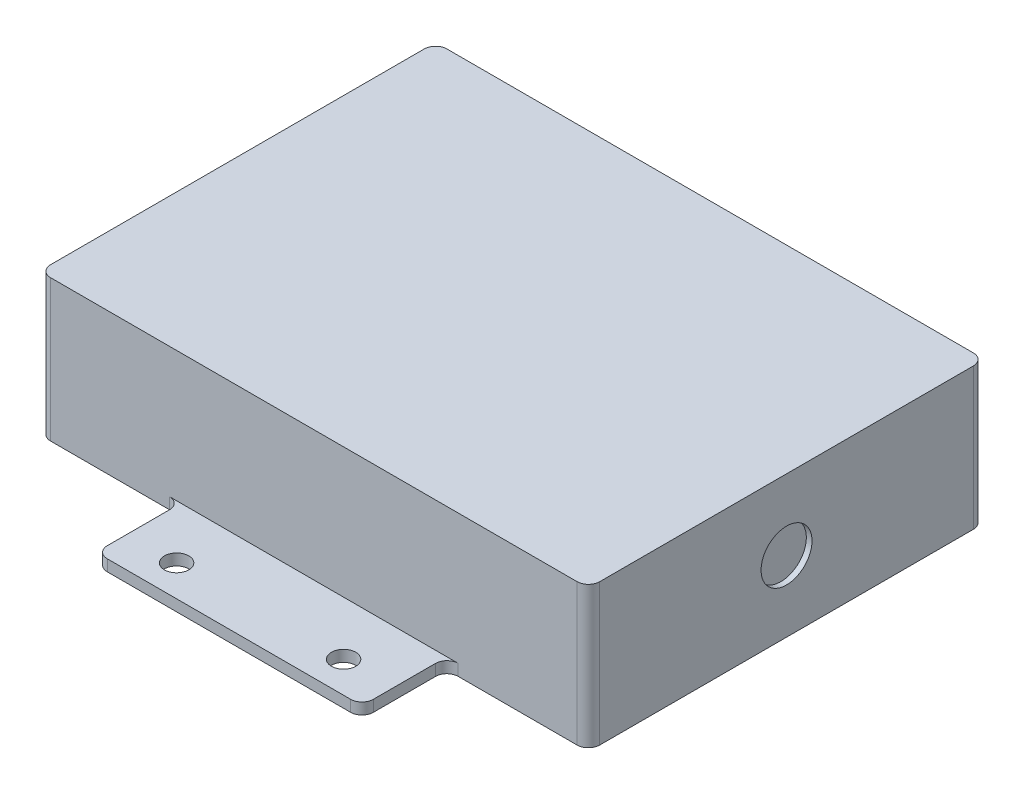
ISO-10303-21;
HEADER;
FILE_DESCRIPTION(('STEP AP214'),'2;1');
FILE_NAME('part.step','',(''),(''),'','','');
FILE_SCHEMA(('AUTOMOTIVE_DESIGN { 1 0 10303 214 1 1 1 1 }'));
ENDSEC;
DATA;
#1=APPLICATION_CONTEXT('core data for automotive mechanical design processes');
#2=APPLICATION_PROTOCOL_DEFINITION('international standard','automotive_design',2000,#1);
#3=PRODUCT_CONTEXT('',#1,'mechanical');
#4=PRODUCT('Part','Part','',(#3));
#5=PRODUCT_RELATED_PRODUCT_CATEGORY('part','',(#4));
#6=PRODUCT_DEFINITION_FORMATION('','',#4);
#7=PRODUCT_DEFINITION_CONTEXT('part definition',#1,'design');
#8=PRODUCT_DEFINITION('design','',#6,#7);
#9=PRODUCT_DEFINITION_SHAPE('','',#8);
#10=(LENGTH_UNIT() NAMED_UNIT(*) SI_UNIT(.MILLI.,.METRE.));
#11=(NAMED_UNIT(*) PLANE_ANGLE_UNIT() SI_UNIT($,.RADIAN.));
#12=(NAMED_UNIT(*) SI_UNIT($,.STERADIAN.) SOLID_ANGLE_UNIT());
#13=UNCERTAINTY_MEASURE_WITH_UNIT(LENGTH_MEASURE(1.E-05),#10,'distance_accuracy_value','');
#14=(GEOMETRIC_REPRESENTATION_CONTEXT(3) GLOBAL_UNCERTAINTY_ASSIGNED_CONTEXT((#13)) GLOBAL_UNIT_ASSIGNED_CONTEXT((#10,
#11,#12)) REPRESENTATION_CONTEXT('',''));
#15=CARTESIAN_POINT('',(0.,0.,0.));
#16=DIRECTION('',(0.,0.,1.));
#17=DIRECTION('',(1.,0.,0.));
#18=AXIS2_PLACEMENT_3D('',#15,#16,#17);
#19=CARTESIAN_POINT('',(0.,0.,0.));
#20=DIRECTION('',(0.,-1.,0.));
#21=DIRECTION('',(0.,0.,-1.));
#22=AXIS2_PLACEMENT_3D('',#19,#20,#21);
#23=PLANE('',#22);
#24=DIRECTION('',(-1.,0.,0.));
#25=VECTOR('',#24,1.);
#26=CARTESIAN_POINT('',(-48.5,0.,-50.));
#27=LINE('',#26,#25);
#28=CARTESIAN_POINT('',(21.5,0.,-50.));
#29=VERTEX_POINT('',#28);
#30=CARTESIAN_POINT('',(-21.5,0.,-50.));
#31=VERTEX_POINT('',#30);
#32=EDGE_CURVE('E300',#29,#31,#27,.T.);
#33=ORIENTED_EDGE('',*,*,#32,.F.);
#34=CARTESIAN_POINT('',(21.5,0.,-48.));
#35=DIRECTION('',(0.,-1.,0.));
#36=DIRECTION('',(0.,0.,-1.));
#37=AXIS2_PLACEMENT_3D('',#34,#35,#36);
#38=CIRCLE('',#37,2.);
#39=CARTESIAN_POINT('',(23.5,0.,-48.));
#40=VERTEX_POINT('',#39);
#41=EDGE_CURVE('E354',#29,#40,#38,.T.);
#42=ORIENTED_EDGE('',*,*,#41,.T.);
#43=DIRECTION('',(0.,0.,1.));
#44=VECTOR('',#43,1.);
#45=CARTESIAN_POINT('',(23.5,0.,-50.));
#46=LINE('',#45,#44);
#47=CARTESIAN_POINT('',(23.5,0.,-37.));
#48=VERTEX_POINT('',#47);
#49=EDGE_CURVE('E450',#40,#48,#46,.T.);
#50=ORIENTED_EDGE('',*,*,#49,.T.);
#51=CARTESIAN_POINT('',(25.5,0.,-37.));
#52=DIRECTION('',(0.,-1.,0.));
#53=DIRECTION('',(0.,0.,-1.));
#54=AXIS2_PLACEMENT_3D('',#51,#52,#53);
#55=CIRCLE('',#54,2.);
#56=CARTESIAN_POINT('',(25.5,0.,-35.));
#57=VERTEX_POINT('',#56);
#58=EDGE_CURVE('E408',#48,#57,#55,.F.);
#59=ORIENTED_EDGE('',*,*,#58,.T.);
#60=DIRECTION('',(1.,0.,0.));
#61=VECTOR('',#60,1.);
#62=CARTESIAN_POINT('',(48.5,0.,-35.));
#63=LINE('',#62,#61);
#64=CARTESIAN_POINT('',(46.5,0.,-35.));
#65=VERTEX_POINT('',#64);
#66=EDGE_CURVE('E451',#57,#65,#63,.T.);
#67=ORIENTED_EDGE('',*,*,#66,.T.);
#68=CARTESIAN_POINT('',(46.5,0.,-33.));
#69=DIRECTION('',(0.,-1.,0.));
#70=DIRECTION('',(0.,0.,-1.));
#71=AXIS2_PLACEMENT_3D('',#68,#69,#70);
#72=CIRCLE('',#71,2.);
#73=CARTESIAN_POINT('',(48.5,0.,-33.));
#74=VERTEX_POINT('',#73);
#75=EDGE_CURVE('E342',#65,#74,#72,.T.);
#76=ORIENTED_EDGE('',*,*,#75,.T.);
#77=DIRECTION('',(0.,0.,-1.));
#78=VECTOR('',#77,1.);
#79=CARTESIAN_POINT('',(48.5,0.,50.));
#80=LINE('',#79,#78);
#81=CARTESIAN_POINT('',(48.5,0.,33.));
#82=VERTEX_POINT('',#81);
#83=EDGE_CURVE('E289',#82,#74,#80,.T.);
#84=ORIENTED_EDGE('',*,*,#83,.F.);
#85=CARTESIAN_POINT('',(46.5,0.,33.));
#86=DIRECTION('',(0.,-1.,0.));
#87=DIRECTION('',(0.,0.,-1.));
#88=AXIS2_PLACEMENT_3D('',#85,#86,#87);
#89=CIRCLE('',#88,2.);
#90=CARTESIAN_POINT('',(46.5,0.,35.));
#91=VERTEX_POINT('',#90);
#92=EDGE_CURVE('E340',#82,#91,#89,.T.);
#93=ORIENTED_EDGE('',*,*,#92,.T.);
#94=DIRECTION('',(-1.,0.,0.));
#95=VECTOR('',#94,1.);
#96=CARTESIAN_POINT('',(48.5,0.,35.));
#97=LINE('',#96,#95);
#98=CARTESIAN_POINT('',(25.5,0.,35.));
#99=VERTEX_POINT('',#98);
#100=EDGE_CURVE('E431',#91,#99,#97,.T.);
#101=ORIENTED_EDGE('',*,*,#100,.T.);
#102=CARTESIAN_POINT('',(25.5,0.,37.));
#103=DIRECTION('',(0.,-1.,0.));
#104=DIRECTION('',(0.,0.,-1.));
#105=AXIS2_PLACEMENT_3D('',#102,#103,#104);
#106=CIRCLE('',#105,2.);
#107=CARTESIAN_POINT('',(23.5,0.,37.));
#108=VERTEX_POINT('',#107);
#109=EDGE_CURVE('E12',#99,#108,#106,.F.);
#110=ORIENTED_EDGE('',*,*,#109,.T.);
#111=DIRECTION('',(0.,0.,1.));
#112=VECTOR('',#111,1.);
#113=CARTESIAN_POINT('',(23.5,0.,50.));
#114=LINE('',#113,#112);
#115=CARTESIAN_POINT('',(23.5,0.,48.));
#116=VERTEX_POINT('',#115);
#117=EDGE_CURVE('E440',#108,#116,#114,.T.);
#118=ORIENTED_EDGE('',*,*,#117,.T.);
#119=CARTESIAN_POINT('',(21.5,0.,48.));
#120=DIRECTION('',(0.,-1.,0.));
#121=DIRECTION('',(0.,0.,-1.));
#122=AXIS2_PLACEMENT_3D('',#119,#120,#121);
#123=CIRCLE('',#122,2.);
#124=CARTESIAN_POINT('',(21.5,0.,50.));
#125=VERTEX_POINT('',#124);
#126=EDGE_CURVE('E344',#116,#125,#123,.T.);
#127=ORIENTED_EDGE('',*,*,#126,.T.);
#128=DIRECTION('',(1.,0.,0.));
#129=VECTOR('',#128,1.);
#130=CARTESIAN_POINT('',(-48.5,0.,50.));
#131=LINE('',#130,#129);
#132=CARTESIAN_POINT('',(-21.5,0.,50.));
#133=VERTEX_POINT('',#132);
#134=EDGE_CURVE('E294',#133,#125,#131,.T.);
#135=ORIENTED_EDGE('',*,*,#134,.F.);
#136=CARTESIAN_POINT('',(-21.5,0.,48.));
#137=DIRECTION('',(0.,-1.,0.));
#138=DIRECTION('',(0.,0.,-1.));
#139=AXIS2_PLACEMENT_3D('',#136,#137,#138);
#140=CIRCLE('',#139,2.);
#141=CARTESIAN_POINT('',(-23.5,0.,48.));
#142=VERTEX_POINT('',#141);
#143=EDGE_CURVE('E346',#133,#142,#140,.T.);
#144=ORIENTED_EDGE('',*,*,#143,.T.);
#145=DIRECTION('',(0.,0.,-1.));
#146=VECTOR('',#145,1.);
#147=CARTESIAN_POINT('',(-23.5,0.,50.));
#148=LINE('',#147,#146);
#149=CARTESIAN_POINT('',(-23.5,0.,37.));
#150=VERTEX_POINT('',#149);
#151=EDGE_CURVE('E459',#142,#150,#148,.T.);
#152=ORIENTED_EDGE('',*,*,#151,.T.);
#153=CARTESIAN_POINT('',(-25.5,0.,37.));
#154=DIRECTION('',(0.,-1.,0.));
#155=DIRECTION('',(0.,0.,-1.));
#156=AXIS2_PLACEMENT_3D('',#153,#154,#155);
#157=CIRCLE('',#156,2.);
#158=CARTESIAN_POINT('',(-25.5,0.,35.));
#159=VERTEX_POINT('',#158);
#160=EDGE_CURVE('E417',#150,#159,#157,.F.);
#161=ORIENTED_EDGE('',*,*,#160,.T.);
#162=DIRECTION('',(-1.,0.,0.));
#163=VECTOR('',#162,1.);
#164=CARTESIAN_POINT('',(-48.5,0.,35.));
#165=LINE('',#164,#163);
#166=CARTESIAN_POINT('',(-46.5,0.,35.));
#167=VERTEX_POINT('',#166);
#168=EDGE_CURVE('E442',#159,#167,#165,.T.);
#169=ORIENTED_EDGE('',*,*,#168,.T.);
#170=CARTESIAN_POINT('',(-46.5,0.,33.));
#171=DIRECTION('',(0.,-1.,0.));
#172=DIRECTION('',(0.,0.,-1.));
#173=AXIS2_PLACEMENT_3D('',#170,#171,#172);
#174=CIRCLE('',#173,2.);
#175=CARTESIAN_POINT('',(-48.5,0.,33.));
#176=VERTEX_POINT('',#175);
#177=EDGE_CURVE('E348',#167,#176,#174,.T.);
#178=ORIENTED_EDGE('',*,*,#177,.T.);
#179=DIRECTION('',(0.,0.,1.));
#180=VECTOR('',#179,1.);
#181=CARTESIAN_POINT('',(-48.5,0.,50.));
#182=LINE('',#181,#180);
#183=CARTESIAN_POINT('',(-48.5,0.,-33.));
#184=VERTEX_POINT('',#183);
#185=EDGE_CURVE('E303',#184,#176,#182,.T.);
#186=ORIENTED_EDGE('',*,*,#185,.F.);
#187=CARTESIAN_POINT('',(-46.5,0.,-33.));
#188=DIRECTION('',(0.,-1.,0.));
#189=DIRECTION('',(0.,0.,-1.));
#190=AXIS2_PLACEMENT_3D('',#187,#188,#189);
#191=CIRCLE('',#190,2.);
#192=CARTESIAN_POINT('',(-46.5,0.,-35.));
#193=VERTEX_POINT('',#192);
#194=EDGE_CURVE('E350',#184,#193,#191,.T.);
#195=ORIENTED_EDGE('',*,*,#194,.T.);
#196=DIRECTION('',(1.,0.,0.));
#197=VECTOR('',#196,1.);
#198=CARTESIAN_POINT('',(-48.5,0.,-35.));
#199=LINE('',#198,#197);
#200=CARTESIAN_POINT('',(-25.5,0.,-35.));
#201=VERTEX_POINT('',#200);
#202=EDGE_CURVE('E464',#193,#201,#199,.T.);
#203=ORIENTED_EDGE('',*,*,#202,.T.);
#204=CARTESIAN_POINT('',(-25.5,0.,-37.));
#205=DIRECTION('',(0.,-1.,0.));
#206=DIRECTION('',(0.,0.,-1.));
#207=AXIS2_PLACEMENT_3D('',#204,#205,#206);
#208=CIRCLE('',#207,2.);
#209=CARTESIAN_POINT('',(-23.5,0.,-37.));
#210=VERTEX_POINT('',#209);
#211=EDGE_CURVE('E413',#201,#210,#208,.F.);
#212=ORIENTED_EDGE('',*,*,#211,.T.);
#213=DIRECTION('',(0.,0.,-1.));
#214=VECTOR('',#213,1.);
#215=CARTESIAN_POINT('',(-23.5,0.,-50.));
#216=LINE('',#215,#214);
#217=CARTESIAN_POINT('',(-23.5,0.,-48.));
#218=VERTEX_POINT('',#217);
#219=EDGE_CURVE('E467',#210,#218,#216,.T.);
#220=ORIENTED_EDGE('',*,*,#219,.T.);
#221=CARTESIAN_POINT('',(-21.5,0.,-48.));
#222=DIRECTION('',(0.,-1.,0.));
#223=DIRECTION('',(0.,0.,-1.));
#224=AXIS2_PLACEMENT_3D('',#221,#222,#223);
#225=CIRCLE('',#224,2.);
#226=EDGE_CURVE('E352',#218,#31,#225,.T.);
#227=ORIENTED_EDGE('',*,*,#226,.T.);
#228=EDGE_LOOP('',(#33,#42,#50,#59,#67,#76,#84,#93,#101,#110,#118,#127,#135,#144,#152,#161,#169,
#178,#186,#195,#203,#212,#220,#227));
#229=FACE_BOUND('',#228,.T.);
#230=CARTESIAN_POINT('',(-14.75,0.,44.5));
#231=DIRECTION('',(0.,1.,0.));
#232=DIRECTION('',(0.,0.,1.));
#233=AXIS2_PLACEMENT_3D('',#230,#231,#232);
#234=CIRCLE('',#233,2.14999999999999);
#235=CARTESIAN_POINT('',(-14.75,0.,46.65));
#236=VERTEX_POINT('',#235);
#237=EDGE_CURVE('E283',#236,#236,#234,.T.);
#238=ORIENTED_EDGE('',*,*,#237,.T.);
#239=EDGE_LOOP('',(#238));
#240=FACE_BOUND('',#239,.T.);
#241=CARTESIAN_POINT('',(14.75,0.,44.5));
#242=DIRECTION('',(0.,1.,0.));
#243=DIRECTION('',(0.,0.,1.));
#244=AXIS2_PLACEMENT_3D('',#241,#242,#243);
#245=CIRCLE('',#244,2.14999999999999);
#246=CARTESIAN_POINT('',(14.75,0.,46.65));
#247=VERTEX_POINT('',#246);
#248=EDGE_CURVE('E286',#247,#247,#245,.T.);
#249=ORIENTED_EDGE('',*,*,#248,.T.);
#250=EDGE_LOOP('',(#249));
#251=FACE_BOUND('',#250,.T.);
#252=CARTESIAN_POINT('',(14.75,0.,-44.5));
#253=DIRECTION('',(0.,1.,0.));
#254=DIRECTION('',(0.,0.,1.));
#255=AXIS2_PLACEMENT_3D('',#252,#253,#254);
#256=CIRCLE('',#255,2.14999999999999);
#257=CARTESIAN_POINT('',(14.75,0.,-42.35));
#258=VERTEX_POINT('',#257);
#259=EDGE_CURVE('E280',#258,#258,#256,.T.);
#260=ORIENTED_EDGE('',*,*,#259,.T.);
#261=EDGE_LOOP('',(#260));
#262=FACE_BOUND('',#261,.T.);
#263=CARTESIAN_POINT('',(-14.75,0.,-44.5));
#264=DIRECTION('',(0.,1.,0.));
#265=DIRECTION('',(0.,0.,1.));
#266=AXIS2_PLACEMENT_3D('',#263,#264,#265);
#267=CIRCLE('',#266,2.14999999999999);
#268=CARTESIAN_POINT('',(-14.75,0.,-42.35));
#269=VERTEX_POINT('',#268);
#270=EDGE_CURVE('E274',#269,#269,#267,.T.);
#271=ORIENTED_EDGE('',*,*,#270,.T.);
#272=EDGE_LOOP('',(#271));
#273=FACE_BOUND('',#272,.T.);
#274=ADVANCED_FACE('F45',(#229,#240,#251,#262,#273),#23,.T.);
#275=CARTESIAN_POINT('',(0.,25.,0.));
#276=DIRECTION('',(0.,-1.,0.));
#277=DIRECTION('',(0.,0.,-1.));
#278=AXIS2_PLACEMENT_3D('',#275,#276,#277);
#279=PLANE('',#278);
#280=DIRECTION('',(1.,0.,0.));
#281=VECTOR('',#280,1.);
#282=CARTESIAN_POINT('',(-48.5,25.,-35.));
#283=LINE('',#282,#281);
#284=CARTESIAN_POINT('',(-46.5,25.,-35.));
#285=VERTEX_POINT('',#284);
#286=CARTESIAN_POINT('',(46.5,25.,-35.));
#287=VERTEX_POINT('',#286);
#288=EDGE_CURVE('E472',#285,#287,#283,.T.);
#289=ORIENTED_EDGE('',*,*,#288,.F.);
#290=CARTESIAN_POINT('',(-46.5,25.,-33.));
#291=DIRECTION('',(0.,-1.,0.));
#292=DIRECTION('',(0.,0.,-1.));
#293=AXIS2_PLACEMENT_3D('',#290,#291,#292);
#294=CIRCLE('',#293,2.);
#295=CARTESIAN_POINT('',(-48.5,25.,-33.));
#296=VERTEX_POINT('',#295);
#297=EDGE_CURVE('E367',#285,#296,#294,.F.);
#298=ORIENTED_EDGE('',*,*,#297,.T.);
#299=DIRECTION('',(0.,0.,1.));
#300=VECTOR('',#299,1.);
#301=CARTESIAN_POINT('',(-48.5,25.,50.));
#302=LINE('',#301,#300);
#303=CARTESIAN_POINT('',(-48.5,25.,33.));
#304=VERTEX_POINT('',#303);
#305=EDGE_CURVE('E293',#296,#304,#302,.T.);
#306=ORIENTED_EDGE('',*,*,#305,.T.);
#307=CARTESIAN_POINT('',(-46.5,25.,33.));
#308=DIRECTION('',(0.,-1.,0.));
#309=DIRECTION('',(0.,0.,-1.));
#310=AXIS2_PLACEMENT_3D('',#307,#308,#309);
#311=CIRCLE('',#310,2.);
#312=CARTESIAN_POINT('',(-46.5,25.,35.));
#313=VERTEX_POINT('',#312);
#314=EDGE_CURVE('E365',#304,#313,#311,.F.);
#315=ORIENTED_EDGE('',*,*,#314,.T.);
#316=DIRECTION('',(-1.,0.,0.));
#317=VECTOR('',#316,1.);
#318=CARTESIAN_POINT('',(-48.5,25.,35.));
#319=LINE('',#318,#317);
#320=CARTESIAN_POINT('',(46.5,25.,35.));
#321=VERTEX_POINT('',#320);
#322=EDGE_CURVE('E476',#321,#313,#319,.T.);
#323=ORIENTED_EDGE('',*,*,#322,.F.);
#324=CARTESIAN_POINT('',(46.5,25.,33.));
#325=DIRECTION('',(0.,-1.,0.));
#326=DIRECTION('',(0.,0.,-1.));
#327=AXIS2_PLACEMENT_3D('',#324,#325,#326);
#328=CIRCLE('',#327,2.);
#329=CARTESIAN_POINT('',(48.5,25.,33.));
#330=VERTEX_POINT('',#329);
#331=EDGE_CURVE('E361',#321,#330,#328,.F.);
#332=ORIENTED_EDGE('',*,*,#331,.T.);
#333=DIRECTION('',(0.,0.,-1.));
#334=VECTOR('',#333,1.);
#335=CARTESIAN_POINT('',(48.5,25.,50.));
#336=LINE('',#335,#334);
#337=CARTESIAN_POINT('',(48.5,25.,-33.));
#338=VERTEX_POINT('',#337);
#339=EDGE_CURVE('E290',#330,#338,#336,.T.);
#340=ORIENTED_EDGE('',*,*,#339,.T.);
#341=CARTESIAN_POINT('',(46.5,25.,-33.));
#342=DIRECTION('',(0.,-1.,0.));
#343=DIRECTION('',(0.,0.,-1.));
#344=AXIS2_PLACEMENT_3D('',#341,#342,#343);
#345=CIRCLE('',#344,2.);
#346=EDGE_CURVE('E363',#338,#287,#345,.F.);
#347=ORIENTED_EDGE('',*,*,#346,.T.);
#348=EDGE_LOOP('',(#289,#298,#306,#315,#323,#332,#340,#347));
#349=FACE_BOUND('',#348,.T.);
#350=ADVANCED_FACE('F499',(#349),#279,.F.);
#351=CARTESIAN_POINT('',(48.5,25.,50.));
#352=DIRECTION('',(-1.,0.,0.));
#353=DIRECTION('',(0.,0.,1.));
#354=AXIS2_PLACEMENT_3D('',#351,#352,#353);
#355=PLANE('',#354);
#356=CARTESIAN_POINT('',(48.5,12.5,0.));
#357=DIRECTION('',(1.,0.,0.));
#358=DIRECTION('',(0.,0.,-1.));
#359=AXIS2_PLACEMENT_3D('',#356,#357,#358);
#360=CIRCLE('',#359,4.5);
#361=CARTESIAN_POINT('',(48.5,12.5,-4.5));
#362=VERTEX_POINT('',#361);
#363=EDGE_CURVE('E261',#362,#362,#360,.T.);
#364=ORIENTED_EDGE('',*,*,#363,.F.);
#365=EDGE_LOOP('',(#364));
#366=FACE_BOUND('',#365,.T.);
#367=ORIENTED_EDGE('',*,*,#83,.T.);
#368=DIRECTION('',(0.,1.,0.));
#369=VECTOR('',#368,1.);
#370=CARTESIAN_POINT('',(48.5,25.,-33.));
#371=LINE('',#370,#369);
#372=EDGE_CURVE('E403',#74,#338,#371,.T.);
#373=ORIENTED_EDGE('',*,*,#372,.T.);
#374=ORIENTED_EDGE('',*,*,#339,.F.);
#375=DIRECTION('',(0.,1.,0.));
#376=VECTOR('',#375,1.);
#377=CARTESIAN_POINT('',(48.5,25.,33.));
#378=LINE('',#377,#376);
#379=EDGE_CURVE('E401',#330,#82,#378,.F.);
#380=ORIENTED_EDGE('',*,*,#379,.T.);
#381=EDGE_LOOP('',(#367,#373,#374,#380));
#382=FACE_BOUND('',#381,.T.);
#383=ADVANCED_FACE('F495',(#366,#382),#355,.F.);
#384=CARTESIAN_POINT('',(-48.5,25.,-50.));
#385=DIRECTION('',(0.,0.,1.));
#386=DIRECTION('',(1.,0.,0.));
#387=AXIS2_PLACEMENT_3D('',#384,#385,#386);
#388=PLANE('',#387);
#389=DIRECTION('',(-1.,0.,0.));
#390=VECTOR('',#389,1.);
#391=CARTESIAN_POINT('',(-48.5,2.,-50.));
#392=LINE('',#391,#390);
#393=CARTESIAN_POINT('',(21.5,2.,-50.));
#394=VERTEX_POINT('',#393);
#395=CARTESIAN_POINT('',(-21.5,2.,-50.));
#396=VERTEX_POINT('',#395);
#397=EDGE_CURVE('E312',#394,#396,#392,.T.);
#398=ORIENTED_EDGE('',*,*,#397,.F.);
#399=DIRECTION('',(0.,1.,0.));
#400=VECTOR('',#399,1.);
#401=CARTESIAN_POINT('',(21.5,25.,-50.));
#402=LINE('',#401,#400);
#403=EDGE_CURVE('E338',#394,#29,#402,.F.);
#404=ORIENTED_EDGE('',*,*,#403,.T.);
#405=ORIENTED_EDGE('',*,*,#32,.T.);
#406=DIRECTION('',(0.,1.,0.));
#407=VECTOR('',#406,1.);
#408=CARTESIAN_POINT('',(-21.5,25.,-50.));
#409=LINE('',#408,#407);
#410=EDGE_CURVE('E335',#31,#396,#409,.T.);
#411=ORIENTED_EDGE('',*,*,#410,.T.);
#412=EDGE_LOOP('',(#398,#404,#405,#411));
#413=FACE_BOUND('',#412,.T.);
#414=ADVANCED_FACE('F498',(#413),#388,.F.);
#415=CARTESIAN_POINT('',(-48.5,25.,50.));
#416=DIRECTION('',(1.,0.,0.));
#417=DIRECTION('',(0.,0.,-1.));
#418=AXIS2_PLACEMENT_3D('',#415,#416,#417);
#419=PLANE('',#418);
#420=DIRECTION('',(0.,0.,-1.));
#421=VECTOR('',#420,1.);
#422=CARTESIAN_POINT('',(-48.5,20.,-16.));
#423=LINE('',#422,#421);
#424=CARTESIAN_POINT('',(-48.5,20.,16.));
#425=VERTEX_POINT('',#424);
#426=CARTESIAN_POINT('',(-48.5,20.,-16.));
#427=VERTEX_POINT('',#426);
#428=EDGE_CURVE('E267',#425,#427,#423,.T.);
#429=ORIENTED_EDGE('',*,*,#428,.F.);
#430=DIRECTION('',(0.,1.,0.));
#431=VECTOR('',#430,1.);
#432=CARTESIAN_POINT('',(-48.5,7.,16.));
#433=LINE('',#432,#431);
#434=CARTESIAN_POINT('',(-48.5,7.,16.));
#435=VERTEX_POINT('',#434);
#436=EDGE_CURVE('E238',#435,#425,#433,.T.);
#437=ORIENTED_EDGE('',*,*,#436,.F.);
#438=DIRECTION('',(0.,0.,1.));
#439=VECTOR('',#438,1.);
#440=CARTESIAN_POINT('',(-48.5,7.,-16.));
#441=LINE('',#440,#439);
#442=CARTESIAN_POINT('',(-48.5,7.,-16.));
#443=VERTEX_POINT('',#442);
#444=EDGE_CURVE('E255',#443,#435,#441,.T.);
#445=ORIENTED_EDGE('',*,*,#444,.F.);
#446=DIRECTION('',(0.,-1.,0.));
#447=VECTOR('',#446,1.);
#448=CARTESIAN_POINT('',(-48.5,7.,-16.));
#449=LINE('',#448,#447);
#450=EDGE_CURVE('E258',#427,#443,#449,.T.);
#451=ORIENTED_EDGE('',*,*,#450,.F.);
#452=EDGE_LOOP('',(#429,#437,#445,#451));
#453=FACE_BOUND('',#452,.T.);
#454=ORIENTED_EDGE('',*,*,#305,.F.);
#455=DIRECTION('',(0.,1.,0.));
#456=VECTOR('',#455,1.);
#457=CARTESIAN_POINT('',(-48.5,25.,-33.));
#458=LINE('',#457,#456);
#459=EDGE_CURVE('E372',#296,#184,#458,.F.);
#460=ORIENTED_EDGE('',*,*,#459,.T.);
#461=ORIENTED_EDGE('',*,*,#185,.T.);
#462=DIRECTION('',(0.,1.,0.));
#463=VECTOR('',#462,1.);
#464=CARTESIAN_POINT('',(-48.5,25.,33.));
#465=LINE('',#464,#463);
#466=EDGE_CURVE('E369',#176,#304,#465,.T.);
#467=ORIENTED_EDGE('',*,*,#466,.T.);
#468=EDGE_LOOP('',(#454,#460,#461,#467));
#469=FACE_BOUND('',#468,.T.);
#470=ADVANCED_FACE('F521',(#453,#469),#419,.F.);
#471=CARTESIAN_POINT('',(-48.5,25.,50.));
#472=DIRECTION('',(0.,0.,-1.));
#473=DIRECTION('',(-1.,0.,0.));
#474=AXIS2_PLACEMENT_3D('',#471,#472,#473);
#475=PLANE('',#474);
#476=DIRECTION('',(1.,0.,0.));
#477=VECTOR('',#476,1.);
#478=CARTESIAN_POINT('',(-48.5,2.,50.));
#479=LINE('',#478,#477);
#480=CARTESIAN_POINT('',(-21.5,2.,50.));
#481=VERTEX_POINT('',#480);
#482=CARTESIAN_POINT('',(21.5,2.,50.));
#483=VERTEX_POINT('',#482);
#484=EDGE_CURVE('E481',#481,#483,#479,.T.);
#485=ORIENTED_EDGE('',*,*,#484,.F.);
#486=DIRECTION('',(0.,1.,0.));
#487=VECTOR('',#486,1.);
#488=CARTESIAN_POINT('',(-21.5,25.,50.));
#489=LINE('',#488,#487);
#490=EDGE_CURVE('E395',#481,#133,#489,.F.);
#491=ORIENTED_EDGE('',*,*,#490,.T.);
#492=ORIENTED_EDGE('',*,*,#134,.T.);
#493=DIRECTION('',(0.,1.,0.));
#494=VECTOR('',#493,1.);
#495=CARTESIAN_POINT('',(21.5,25.,50.));
#496=LINE('',#495,#494);
#497=EDGE_CURVE('E392',#125,#483,#496,.T.);
#498=ORIENTED_EDGE('',*,*,#497,.T.);
#499=EDGE_LOOP('',(#485,#491,#492,#498));
#500=FACE_BOUND('',#499,.T.);
#501=ADVANCED_FACE('F544',(#500),#475,.F.);
#502=CARTESIAN_POINT('',(14.75,25.,44.5));
#503=DIRECTION('',(0.,1.,0.));
#504=DIRECTION('',(0.,0.,1.));
#505=AXIS2_PLACEMENT_3D('',#502,#503,#504);
#506=CYLINDRICAL_SURFACE('',#505,2.15);
#507=CARTESIAN_POINT('',(14.75,2.,44.5));
#508=DIRECTION('',(0.,-1.,0.));
#509=DIRECTION('',(0.,0.,-1.));
#510=AXIS2_PLACEMENT_3D('',#507,#508,#509);
#511=CIRCLE('',#510,2.15);
#512=CARTESIAN_POINT('',(14.75,2.,42.35));
#513=VERTEX_POINT('',#512);
#514=EDGE_CURVE('E316',#513,#513,#511,.F.);
#515=ORIENTED_EDGE('',*,*,#514,.T.);
#516=EDGE_LOOP('',(#515));
#517=FACE_BOUND('',#516,.T.);
#518=ORIENTED_EDGE('',*,*,#248,.F.);
#519=EDGE_LOOP('',(#518));
#520=FACE_BOUND('',#519,.T.);
#521=ADVANCED_FACE('F547',(#517,#520),#506,.F.);
#522=CARTESIAN_POINT('',(-14.75,25.,44.5));
#523=DIRECTION('',(0.,1.,0.));
#524=DIRECTION('',(0.,0.,1.));
#525=AXIS2_PLACEMENT_3D('',#522,#523,#524);
#526=CYLINDRICAL_SURFACE('',#525,2.15);
#527=CARTESIAN_POINT('',(-14.75,2.,44.5));
#528=DIRECTION('',(0.,-1.,0.));
#529=DIRECTION('',(0.,0.,-1.));
#530=AXIS2_PLACEMENT_3D('',#527,#528,#529);
#531=CIRCLE('',#530,2.15);
#532=CARTESIAN_POINT('',(-14.75,2.,42.35));
#533=VERTEX_POINT('',#532);
#534=EDGE_CURVE('E313',#533,#533,#531,.F.);
#535=ORIENTED_EDGE('',*,*,#534,.T.);
#536=EDGE_LOOP('',(#535));
#537=FACE_BOUND('',#536,.T.);
#538=ORIENTED_EDGE('',*,*,#237,.F.);
#539=EDGE_LOOP('',(#538));
#540=FACE_BOUND('',#539,.T.);
#541=ADVANCED_FACE('F789',(#537,#540),#526,.F.);
#542=CARTESIAN_POINT('',(14.75,25.,-44.5));
#543=DIRECTION('',(0.,1.,0.));
#544=DIRECTION('',(0.,0.,1.));
#545=AXIS2_PLACEMENT_3D('',#542,#543,#544);
#546=CYLINDRICAL_SURFACE('',#545,2.15);
#547=CARTESIAN_POINT('',(14.75,2.,-44.5));
#548=DIRECTION('',(0.,-1.,0.));
#549=DIRECTION('',(0.,0.,-1.));
#550=AXIS2_PLACEMENT_3D('',#547,#548,#549);
#551=CIRCLE('',#550,2.15);
#552=CARTESIAN_POINT('',(14.75,2.,-46.65));
#553=VERTEX_POINT('',#552);
#554=EDGE_CURVE('E311',#553,#553,#551,.F.);
#555=ORIENTED_EDGE('',*,*,#554,.T.);
#556=EDGE_LOOP('',(#555));
#557=FACE_BOUND('',#556,.T.);
#558=ORIENTED_EDGE('',*,*,#259,.F.);
#559=EDGE_LOOP('',(#558));
#560=FACE_BOUND('',#559,.T.);
#561=ADVANCED_FACE('F780',(#557,#560),#546,.F.);
#562=CARTESIAN_POINT('',(-14.75,25.,-44.5));
#563=DIRECTION('',(0.,1.,0.));
#564=DIRECTION('',(0.,0.,1.));
#565=AXIS2_PLACEMENT_3D('',#562,#563,#564);
#566=CYLINDRICAL_SURFACE('',#565,2.15);
#567=CARTESIAN_POINT('',(-14.75,2.,-44.5));
#568=DIRECTION('',(0.,-1.,0.));
#569=DIRECTION('',(0.,0.,-1.));
#570=AXIS2_PLACEMENT_3D('',#567,#568,#569);
#571=CIRCLE('',#570,2.15);
#572=CARTESIAN_POINT('',(-14.75,2.,-46.65));
#573=VERTEX_POINT('',#572);
#574=EDGE_CURVE('E308',#573,#573,#571,.F.);
#575=ORIENTED_EDGE('',*,*,#574,.T.);
#576=EDGE_LOOP('',(#575));
#577=FACE_BOUND('',#576,.T.);
#578=ORIENTED_EDGE('',*,*,#270,.F.);
#579=EDGE_LOOP('',(#578));
#580=FACE_BOUND('',#579,.T.);
#581=ADVANCED_FACE('F773',(#577,#580),#566,.F.);
#582=CARTESIAN_POINT('',(-47.5,7.,16.));
#583=DIRECTION('',(0.,0.,1.));
#584=DIRECTION('',(1.,0.,0.));
#585=AXIS2_PLACEMENT_3D('',#582,#583,#584);
#586=PLANE('',#585);
#587=ORIENTED_EDGE('',*,*,#436,.T.);
#588=DIRECTION('',(-1.,0.,0.));
#589=VECTOR('',#588,1.);
#590=CARTESIAN_POINT('',(-47.5,20.,16.));
#591=LINE('',#590,#589);
#592=CARTESIAN_POINT('',(-47.5,20.,16.));
#593=VERTEX_POINT('',#592);
#594=EDGE_CURVE('E231',#593,#425,#591,.T.);
#595=ORIENTED_EDGE('',*,*,#594,.F.);
#596=DIRECTION('',(0.,1.,0.));
#597=VECTOR('',#596,1.);
#598=CARTESIAN_POINT('',(-47.5,7.,16.));
#599=LINE('',#598,#597);
#600=CARTESIAN_POINT('',(-47.5,7.,16.));
#601=VERTEX_POINT('',#600);
#602=EDGE_CURVE('E235',#601,#593,#599,.T.);
#603=ORIENTED_EDGE('',*,*,#602,.F.);
#604=DIRECTION('',(-1.,0.,0.));
#605=VECTOR('',#604,1.);
#606=CARTESIAN_POINT('',(-47.5,7.,16.));
#607=LINE('',#606,#605);
#608=EDGE_CURVE('E272',#601,#435,#607,.T.);
#609=ORIENTED_EDGE('',*,*,#608,.T.);
#610=EDGE_LOOP('',(#587,#595,#603,#609));
#611=FACE_BOUND('',#610,.T.);
#612=ADVANCED_FACE('F233',(#611),#586,.F.);
#613=CARTESIAN_POINT('',(-47.5,7.,-16.));
#614=DIRECTION('',(0.,-1.,0.));
#615=DIRECTION('',(0.,0.,-1.));
#616=AXIS2_PLACEMENT_3D('',#613,#614,#615);
#617=PLANE('',#616);
#618=ORIENTED_EDGE('',*,*,#444,.T.);
#619=ORIENTED_EDGE('',*,*,#608,.F.);
#620=DIRECTION('',(0.,0.,1.));
#621=VECTOR('',#620,1.);
#622=CARTESIAN_POINT('',(-47.5,7.,-16.));
#623=LINE('',#622,#621);
#624=CARTESIAN_POINT('',(-47.5,7.,-16.));
#625=VERTEX_POINT('',#624);
#626=EDGE_CURVE('E243',#625,#601,#623,.T.);
#627=ORIENTED_EDGE('',*,*,#626,.F.);
#628=DIRECTION('',(-1.,0.,0.));
#629=VECTOR('',#628,1.);
#630=CARTESIAN_POINT('',(-47.5,7.,-16.));
#631=LINE('',#630,#629);
#632=EDGE_CURVE('E275',#625,#443,#631,.T.);
#633=ORIENTED_EDGE('',*,*,#632,.T.);
#634=EDGE_LOOP('',(#618,#619,#627,#633));
#635=FACE_BOUND('',#634,.T.);
#636=ADVANCED_FACE('F756',(#635),#617,.F.);
#637=CARTESIAN_POINT('',(-47.5,7.,-16.));
#638=DIRECTION('',(0.,0.,-1.));
#639=DIRECTION('',(-1.,0.,0.));
#640=AXIS2_PLACEMENT_3D('',#637,#638,#639);
#641=PLANE('',#640);
#642=ORIENTED_EDGE('',*,*,#450,.T.);
#643=ORIENTED_EDGE('',*,*,#632,.F.);
#644=DIRECTION('',(0.,-1.,0.));
#645=VECTOR('',#644,1.);
#646=CARTESIAN_POINT('',(-47.5,7.,-16.));
#647=LINE('',#646,#645);
#648=CARTESIAN_POINT('',(-47.5,20.,-16.));
#649=VERTEX_POINT('',#648);
#650=EDGE_CURVE('E251',#649,#625,#647,.T.);
#651=ORIENTED_EDGE('',*,*,#650,.F.);
#652=DIRECTION('',(-1.,0.,0.));
#653=VECTOR('',#652,1.);
#654=CARTESIAN_POINT('',(-47.5,20.,-16.));
#655=LINE('',#654,#653);
#656=EDGE_CURVE('E242',#649,#427,#655,.T.);
#657=ORIENTED_EDGE('',*,*,#656,.T.);
#658=EDGE_LOOP('',(#642,#643,#651,#657));
#659=FACE_BOUND('',#658,.T.);
#660=ADVANCED_FACE('F748',(#659),#641,.F.);
#661=CARTESIAN_POINT('',(-47.5,20.,-16.));
#662=DIRECTION('',(0.,1.,0.));
#663=DIRECTION('',(0.,0.,1.));
#664=AXIS2_PLACEMENT_3D('',#661,#662,#663);
#665=PLANE('',#664);
#666=ORIENTED_EDGE('',*,*,#428,.T.);
#667=ORIENTED_EDGE('',*,*,#656,.F.);
#668=DIRECTION('',(0.,0.,-1.));
#669=VECTOR('',#668,1.);
#670=CARTESIAN_POINT('',(-47.5,20.,-16.));
#671=LINE('',#670,#669);
#672=EDGE_CURVE('E246',#593,#649,#671,.T.);
#673=ORIENTED_EDGE('',*,*,#672,.F.);
#674=ORIENTED_EDGE('',*,*,#594,.T.);
#675=EDGE_LOOP('',(#666,#667,#673,#674));
#676=FACE_BOUND('',#675,.T.);
#677=ADVANCED_FACE('F247',(#676),#665,.F.);
#678=CARTESIAN_POINT('',(-47.5,0.,0.));
#679=DIRECTION('',(1.,0.,0.));
#680=DIRECTION('',(0.,0.,-1.));
#681=AXIS2_PLACEMENT_3D('',#678,#679,#680);
#682=PLANE('',#681);
#683=ORIENTED_EDGE('',*,*,#602,.T.);
#684=ORIENTED_EDGE('',*,*,#672,.T.);
#685=ORIENTED_EDGE('',*,*,#650,.T.);
#686=ORIENTED_EDGE('',*,*,#626,.T.);
#687=EDGE_LOOP('',(#683,#684,#685,#686));
#688=FACE_BOUND('',#687,.T.);
#689=ADVANCED_FACE('F253',(#688),#682,.F.);
#690=CARTESIAN_POINT('',(47.5,12.5,0.));
#691=DIRECTION('',(1.,0.,0.));
#692=DIRECTION('',(0.,0.,-1.));
#693=AXIS2_PLACEMENT_3D('',#690,#691,#692);
#694=CYLINDRICAL_SURFACE('',#693,4.5);
#695=CARTESIAN_POINT('',(47.5,12.5,0.));
#696=DIRECTION('',(1.,0.,0.));
#697=DIRECTION('',(0.,0.,-1.));
#698=AXIS2_PLACEMENT_3D('',#695,#696,#697);
#699=CIRCLE('',#698,4.5);
#700=CARTESIAN_POINT('',(47.5,12.5,-4.5));
#701=VERTEX_POINT('',#700);
#702=EDGE_CURVE('E268',#701,#701,#699,.T.);
#703=ORIENTED_EDGE('',*,*,#702,.F.);
#704=EDGE_LOOP('',(#703));
#705=FACE_BOUND('',#704,.T.);
#706=ORIENTED_EDGE('',*,*,#363,.T.);
#707=EDGE_LOOP('',(#706));
#708=FACE_BOUND('',#707,.T.);
#709=ADVANCED_FACE('F493',(#705,#708),#694,.F.);
#710=CARTESIAN_POINT('',(47.5,12.5,0.));
#711=DIRECTION('',(1.,0.,0.));
#712=DIRECTION('',(0.,0.,-1.));
#713=AXIS2_PLACEMENT_3D('',#710,#711,#712);
#714=PLANE('',#713);
#715=ORIENTED_EDGE('',*,*,#702,.T.);
#716=EDGE_LOOP('',(#715));
#717=FACE_BOUND('',#716,.T.);
#718=ADVANCED_FACE('F717',(#717),#714,.T.);
#719=CARTESIAN_POINT('',(0.,2.,0.));
#720=DIRECTION('',(0.,-1.,0.));
#721=DIRECTION('',(0.,0.,-1.));
#722=AXIS2_PLACEMENT_3D('',#719,#720,#721);
#723=PLANE('',#722);
#724=ORIENTED_EDGE('',*,*,#574,.F.);
#725=EDGE_LOOP('',(#724));
#726=FACE_BOUND('',#725,.T.);
#727=DIRECTION('',(0.,0.,1.));
#728=VECTOR('',#727,1.);
#729=CARTESIAN_POINT('',(23.5,2.,-50.));
#730=LINE('',#729,#728);
#731=CARTESIAN_POINT('',(23.5,2.,-48.));
#732=VERTEX_POINT('',#731);
#733=CARTESIAN_POINT('',(23.5,2.,-37.));
#734=VERTEX_POINT('',#733);
#735=EDGE_CURVE('E446',#732,#734,#730,.T.);
#736=ORIENTED_EDGE('',*,*,#735,.F.);
#737=CARTESIAN_POINT('',(21.5,2.,-48.));
#738=DIRECTION('',(0.,-1.,0.));
#739=DIRECTION('',(0.,0.,-1.));
#740=AXIS2_PLACEMENT_3D('',#737,#738,#739);
#741=CIRCLE('',#740,2.);
#742=EDGE_CURVE('E333',#732,#394,#741,.F.);
#743=ORIENTED_EDGE('',*,*,#742,.T.);
#744=ORIENTED_EDGE('',*,*,#397,.T.);
#745=CARTESIAN_POINT('',(-21.5,2.,-48.));
#746=DIRECTION('',(0.,-1.,0.));
#747=DIRECTION('',(0.,0.,-1.));
#748=AXIS2_PLACEMENT_3D('',#745,#746,#747);
#749=CIRCLE('',#748,2.);
#750=CARTESIAN_POINT('',(-23.5,2.,-48.));
#751=VERTEX_POINT('',#750);
#752=EDGE_CURVE('E331',#396,#751,#749,.F.);
#753=ORIENTED_EDGE('',*,*,#752,.T.);
#754=DIRECTION('',(0.,0.,-1.));
#755=VECTOR('',#754,1.);
#756=CARTESIAN_POINT('',(-23.5,2.,-50.));
#757=LINE('',#756,#755);
#758=CARTESIAN_POINT('',(-23.5,2.,-37.));
#759=VERTEX_POINT('',#758);
#760=EDGE_CURVE('E449',#759,#751,#757,.T.);
#761=ORIENTED_EDGE('',*,*,#760,.F.);
#762=CARTESIAN_POINT('',(-25.5,2.,-37.));
#763=DIRECTION('',(0.,-1.,0.));
#764=DIRECTION('',(0.,0.,-1.));
#765=AXIS2_PLACEMENT_3D('',#762,#763,#764);
#766=CIRCLE('',#765,2.);
#767=CARTESIAN_POINT('',(-25.5,2.,-35.));
#768=VERTEX_POINT('',#767);
#769=EDGE_CURVE('E410',#759,#768,#766,.T.);
#770=ORIENTED_EDGE('',*,*,#769,.T.);
#771=DIRECTION('',(1.,0.,0.));
#772=VECTOR('',#771,1.);
#773=CARTESIAN_POINT('',(-48.5,2.,-35.));
#774=LINE('',#773,#772);
#775=CARTESIAN_POINT('',(25.5,2.,-35.));
#776=VERTEX_POINT('',#775);
#777=EDGE_CURVE('E475',#768,#776,#774,.T.);
#778=ORIENTED_EDGE('',*,*,#777,.T.);
#779=CARTESIAN_POINT('',(25.5,2.,-37.));
#780=DIRECTION('',(0.,-1.,0.));
#781=DIRECTION('',(0.,0.,-1.));
#782=AXIS2_PLACEMENT_3D('',#779,#780,#781);
#783=CIRCLE('',#782,2.);
#784=EDGE_CURVE('E406',#776,#734,#783,.T.);
#785=ORIENTED_EDGE('',*,*,#784,.T.);
#786=EDGE_LOOP('',(#736,#743,#744,#753,#761,#770,#778,#785));
#787=FACE_BOUND('',#786,.T.);
#788=ORIENTED_EDGE('',*,*,#554,.F.);
#789=EDGE_LOOP('',(#788));
#790=FACE_BOUND('',#789,.T.);
#791=ADVANCED_FACE('F709',(#726,#787,#790),#723,.F.);
#792=CARTESIAN_POINT('',(-48.5,-98.1529418815351,-35.));
#793=DIRECTION('',(0.,0.,1.));
#794=DIRECTION('',(1.,0.,0.));
#795=AXIS2_PLACEMENT_3D('',#792,#793,#794);
#796=PLANE('',#795);
#797=ORIENTED_EDGE('',*,*,#66,.F.);
#798=DIRECTION('',(0.,1.,0.));
#799=VECTOR('',#798,1.);
#800=CARTESIAN_POINT('',(25.5,2.,-35.));
#801=LINE('',#800,#799);
#802=EDGE_CURVE('E323',#57,#776,#801,.T.);
#803=ORIENTED_EDGE('',*,*,#802,.T.);
#804=ORIENTED_EDGE('',*,*,#777,.F.);
#805=DIRECTION('',(0.,1.,0.));
#806=VECTOR('',#805,1.);
#807=CARTESIAN_POINT('',(-25.5,0.,-35.));
#808=LINE('',#807,#806);
#809=EDGE_CURVE('E321',#768,#201,#808,.F.);
#810=ORIENTED_EDGE('',*,*,#809,.T.);
#811=ORIENTED_EDGE('',*,*,#202,.F.);
#812=DIRECTION('',(0.,1.,0.));
#813=VECTOR('',#812,1.);
#814=CARTESIAN_POINT('',(-46.5,-98.1529418815351,-35.));
#815=LINE('',#814,#813);
#816=EDGE_CURVE('E318',#193,#285,#815,.T.);
#817=ORIENTED_EDGE('',*,*,#816,.T.);
#818=ORIENTED_EDGE('',*,*,#288,.T.);
#819=DIRECTION('',(0.,1.,0.));
#820=VECTOR('',#819,1.);
#821=CARTESIAN_POINT('',(46.5,-98.1529418815351,-35.));
#822=LINE('',#821,#820);
#823=EDGE_CURVE('E297',#287,#65,#822,.F.);
#824=ORIENTED_EDGE('',*,*,#823,.T.);
#825=EDGE_LOOP('',(#797,#803,#804,#810,#811,#817,#818,#824));
#826=FACE_BOUND('',#825,.T.);
#827=ADVANCED_FACE('F512',(#826),#796,.F.);
#828=CARTESIAN_POINT('',(0.,2.,0.));
#829=DIRECTION('',(0.,-1.,0.));
#830=DIRECTION('',(0.,0.,-1.));
#831=AXIS2_PLACEMENT_3D('',#828,#829,#830);
#832=PLANE('',#831);
#833=ORIENTED_EDGE('',*,*,#534,.F.);
#834=EDGE_LOOP('',(#833));
#835=FACE_BOUND('',#834,.T.);
#836=DIRECTION('',(0.,0.,-1.));
#837=VECTOR('',#836,1.);
#838=CARTESIAN_POINT('',(-23.5,2.,50.));
#839=LINE('',#838,#837);
#840=CARTESIAN_POINT('',(-23.5,2.,48.));
#841=VERTEX_POINT('',#840);
#842=CARTESIAN_POINT('',(-23.5,2.,37.));
#843=VERTEX_POINT('',#842);
#844=EDGE_CURVE('E454',#841,#843,#839,.T.);
#845=ORIENTED_EDGE('',*,*,#844,.F.);
#846=CARTESIAN_POINT('',(-21.5,2.,48.));
#847=DIRECTION('',(0.,-1.,0.));
#848=DIRECTION('',(0.,0.,-1.));
#849=AXIS2_PLACEMENT_3D('',#846,#847,#848);
#850=CIRCLE('',#849,2.);
#851=EDGE_CURVE('E390',#841,#481,#850,.F.);
#852=ORIENTED_EDGE('',*,*,#851,.T.);
#853=ORIENTED_EDGE('',*,*,#484,.T.);
#854=CARTESIAN_POINT('',(21.5,2.,48.));
#855=DIRECTION('',(0.,-1.,0.));
#856=DIRECTION('',(0.,0.,-1.));
#857=AXIS2_PLACEMENT_3D('',#854,#855,#856);
#858=CIRCLE('',#857,2.);
#859=CARTESIAN_POINT('',(23.5,2.,48.));
#860=VERTEX_POINT('',#859);
#861=EDGE_CURVE('E60',#483,#860,#858,.F.);
#862=ORIENTED_EDGE('',*,*,#861,.T.);
#863=DIRECTION('',(0.,0.,1.));
#864=VECTOR('',#863,1.);
#865=CARTESIAN_POINT('',(23.5,2.,50.));
#866=LINE('',#865,#864);
#867=CARTESIAN_POINT('',(23.5,2.,37.));
#868=VERTEX_POINT('',#867);
#869=EDGE_CURVE('E423',#868,#860,#866,.T.);
#870=ORIENTED_EDGE('',*,*,#869,.F.);
#871=CARTESIAN_POINT('',(25.5,2.,37.));
#872=DIRECTION('',(0.,-1.,0.));
#873=DIRECTION('',(0.,0.,-1.));
#874=AXIS2_PLACEMENT_3D('',#871,#872,#873);
#875=CIRCLE('',#874,2.);
#876=CARTESIAN_POINT('',(25.5,2.,35.));
#877=VERTEX_POINT('',#876);
#878=EDGE_CURVE('E53',#868,#877,#875,.T.);
#879=ORIENTED_EDGE('',*,*,#878,.T.);
#880=DIRECTION('',(-1.,0.,0.));
#881=VECTOR('',#880,1.);
#882=CARTESIAN_POINT('',(-48.5,2.,35.));
#883=LINE('',#882,#881);
#884=CARTESIAN_POINT('',(-25.5,2.,35.));
#885=VERTEX_POINT('',#884);
#886=EDGE_CURVE('E421',#877,#885,#883,.T.);
#887=ORIENTED_EDGE('',*,*,#886,.T.);
#888=CARTESIAN_POINT('',(-25.5,2.,37.));
#889=DIRECTION('',(0.,-1.,0.));
#890=DIRECTION('',(0.,0.,-1.));
#891=AXIS2_PLACEMENT_3D('',#888,#889,#890);
#892=CIRCLE('',#891,2.);
#893=EDGE_CURVE('E415',#885,#843,#892,.T.);
#894=ORIENTED_EDGE('',*,*,#893,.T.);
#895=EDGE_LOOP('',(#845,#852,#853,#862,#870,#879,#887,#894));
#896=FACE_BOUND('',#895,.T.);
#897=ORIENTED_EDGE('',*,*,#514,.F.);
#898=EDGE_LOOP('',(#897));
#899=FACE_BOUND('',#898,.T.);
#900=ADVANCED_FACE('F419',(#835,#896,#899),#832,.F.);
#901=CARTESIAN_POINT('',(-48.5,-98.1529418815351,35.));
#902=DIRECTION('',(0.,0.,-1.));
#903=DIRECTION('',(-1.,0.,0.));
#904=AXIS2_PLACEMENT_3D('',#901,#902,#903);
#905=PLANE('',#904);
#906=ORIENTED_EDGE('',*,*,#322,.T.);
#907=DIRECTION('',(0.,1.,0.));
#908=VECTOR('',#907,1.);
#909=CARTESIAN_POINT('',(-46.5,-98.1529418815351,35.));
#910=LINE('',#909,#908);
#911=EDGE_CURVE('E382',#313,#167,#910,.F.);
#912=ORIENTED_EDGE('',*,*,#911,.T.);
#913=ORIENTED_EDGE('',*,*,#168,.F.);
#914=DIRECTION('',(0.,1.,0.));
#915=VECTOR('',#914,1.);
#916=CARTESIAN_POINT('',(-25.5,2.,35.));
#917=LINE('',#916,#915);
#918=EDGE_CURVE('E379',#159,#885,#917,.T.);
#919=ORIENTED_EDGE('',*,*,#918,.T.);
#920=ORIENTED_EDGE('',*,*,#886,.F.);
#921=DIRECTION('',(0.,1.,0.));
#922=VECTOR('',#921,1.);
#923=CARTESIAN_POINT('',(25.5,0.,35.));
#924=LINE('',#923,#922);
#925=EDGE_CURVE('E377',#877,#99,#924,.F.);
#926=ORIENTED_EDGE('',*,*,#925,.T.);
#927=ORIENTED_EDGE('',*,*,#100,.F.);
#928=DIRECTION('',(0.,1.,0.));
#929=VECTOR('',#928,1.);
#930=CARTESIAN_POINT('',(46.5,-98.1529418815351,35.));
#931=LINE('',#930,#929);
#932=EDGE_CURVE('E374',#91,#321,#931,.T.);
#933=ORIENTED_EDGE('',*,*,#932,.T.);
#934=EDGE_LOOP('',(#906,#912,#913,#919,#920,#926,#927,#933));
#935=FACE_BOUND('',#934,.T.);
#936=ADVANCED_FACE('F430',(#935),#905,.F.);
#937=CARTESIAN_POINT('',(23.5,0.,50.));
#938=DIRECTION('',(-1.,0.,0.));
#939=DIRECTION('',(0.,0.,1.));
#940=AXIS2_PLACEMENT_3D('',#937,#938,#939);
#941=PLANE('',#940);
#942=ORIENTED_EDGE('',*,*,#869,.T.);
#943=DIRECTION('',(0.,1.,0.));
#944=VECTOR('',#943,1.);
#945=CARTESIAN_POINT('',(23.5,0.,48.));
#946=LINE('',#945,#944);
#947=EDGE_CURVE('E399',#860,#116,#946,.F.);
#948=ORIENTED_EDGE('',*,*,#947,.T.);
#949=ORIENTED_EDGE('',*,*,#117,.F.);
#950=DIRECTION('',(0.,1.,0.));
#951=VECTOR('',#950,1.);
#952=CARTESIAN_POINT('',(23.5,2.,37.));
#953=LINE('',#952,#951);
#954=EDGE_CURVE('E397',#108,#868,#953,.T.);
#955=ORIENTED_EDGE('',*,*,#954,.T.);
#956=EDGE_LOOP('',(#942,#948,#949,#955));
#957=FACE_BOUND('',#956,.T.);
#958=ADVANCED_FACE('F674',(#957),#941,.F.);
#959=CARTESIAN_POINT('',(-23.5,0.,50.));
#960=DIRECTION('',(1.,0.,0.));
#961=DIRECTION('',(0.,0.,-1.));
#962=AXIS2_PLACEMENT_3D('',#959,#960,#961);
#963=PLANE('',#962);
#964=ORIENTED_EDGE('',*,*,#844,.T.);
#965=DIRECTION('',(0.,1.,0.));
#966=VECTOR('',#965,1.);
#967=CARTESIAN_POINT('',(-23.5,0.,37.));
#968=LINE('',#967,#966);
#969=EDGE_CURVE('E387',#843,#150,#968,.F.);
#970=ORIENTED_EDGE('',*,*,#969,.T.);
#971=ORIENTED_EDGE('',*,*,#151,.F.);
#972=DIRECTION('',(0.,1.,0.));
#973=VECTOR('',#972,1.);
#974=CARTESIAN_POINT('',(-23.5,0.,48.));
#975=LINE('',#974,#973);
#976=EDGE_CURVE('E384',#142,#841,#975,.T.);
#977=ORIENTED_EDGE('',*,*,#976,.T.);
#978=EDGE_LOOP('',(#964,#970,#971,#977));
#979=FACE_BOUND('',#978,.T.);
#980=ADVANCED_FACE('F665',(#979),#963,.F.);
#981=CARTESIAN_POINT('',(-23.5,0.,-50.));
#982=DIRECTION('',(1.,0.,0.));
#983=DIRECTION('',(0.,0.,-1.));
#984=AXIS2_PLACEMENT_3D('',#981,#982,#983);
#985=PLANE('',#984);
#986=ORIENTED_EDGE('',*,*,#760,.T.);
#987=DIRECTION('',(0.,1.,0.));
#988=VECTOR('',#987,1.);
#989=CARTESIAN_POINT('',(-23.5,0.,-48.));
#990=LINE('',#989,#988);
#991=EDGE_CURVE('E359',#751,#218,#990,.F.);
#992=ORIENTED_EDGE('',*,*,#991,.T.);
#993=ORIENTED_EDGE('',*,*,#219,.F.);
#994=DIRECTION('',(0.,1.,0.));
#995=VECTOR('',#994,1.);
#996=CARTESIAN_POINT('',(-23.5,2.,-37.));
#997=LINE('',#996,#995);
#998=EDGE_CURVE('E356',#210,#759,#997,.T.);
#999=ORIENTED_EDGE('',*,*,#998,.T.);
#1000=EDGE_LOOP('',(#986,#992,#993,#999));
#1001=FACE_BOUND('',#1000,.T.);
#1002=ADVANCED_FACE('F656',(#1001),#985,.F.);
#1003=CARTESIAN_POINT('',(23.5,0.,-50.));
#1004=DIRECTION('',(-1.,0.,0.));
#1005=DIRECTION('',(0.,0.,1.));
#1006=AXIS2_PLACEMENT_3D('',#1003,#1004,#1005);
#1007=PLANE('',#1006);
#1008=ORIENTED_EDGE('',*,*,#735,.T.);
#1009=DIRECTION('',(0.,1.,0.));
#1010=VECTOR('',#1009,1.);
#1011=CARTESIAN_POINT('',(23.5,0.,-37.));
#1012=LINE('',#1011,#1010);
#1013=EDGE_CURVE('E329',#734,#48,#1012,.F.);
#1014=ORIENTED_EDGE('',*,*,#1013,.T.);
#1015=ORIENTED_EDGE('',*,*,#49,.F.);
#1016=DIRECTION('',(0.,1.,0.));
#1017=VECTOR('',#1016,1.);
#1018=CARTESIAN_POINT('',(23.5,0.,-48.));
#1019=LINE('',#1018,#1017);
#1020=EDGE_CURVE('E326',#40,#732,#1019,.T.);
#1021=ORIENTED_EDGE('',*,*,#1020,.T.);
#1022=EDGE_LOOP('',(#1008,#1014,#1015,#1021));
#1023=FACE_BOUND('',#1022,.T.);
#1024=ADVANCED_FACE('F559',(#1023),#1007,.F.);
#1025=CARTESIAN_POINT('',(25.5,-98.1529418815351,-37.));
#1026=DIRECTION('',(0.,-1.,0.));
#1027=DIRECTION('',(0.,0.,-1.));
#1028=AXIS2_PLACEMENT_3D('',#1025,#1026,#1027);
#1029=CYLINDRICAL_SURFACE('',#1028,2.);
#1030=ORIENTED_EDGE('',*,*,#58,.F.);
#1031=ORIENTED_EDGE('',*,*,#1013,.F.);
#1032=ORIENTED_EDGE('',*,*,#784,.F.);
#1033=ORIENTED_EDGE('',*,*,#802,.F.);
#1034=EDGE_LOOP('',(#1030,#1031,#1032,#1033));
#1035=FACE_BOUND('',#1034,.T.);
#1036=ADVANCED_FACE('F555',(#1035),#1029,.F.);
#1037=CARTESIAN_POINT('',(21.5,0.,-48.));
#1038=DIRECTION('',(0.,1.,0.));
#1039=DIRECTION('',(0.,0.,1.));
#1040=AXIS2_PLACEMENT_3D('',#1037,#1038,#1039);
#1041=CYLINDRICAL_SURFACE('',#1040,2.);
#1042=ORIENTED_EDGE('',*,*,#41,.F.);
#1043=ORIENTED_EDGE('',*,*,#403,.F.);
#1044=ORIENTED_EDGE('',*,*,#742,.F.);
#1045=ORIENTED_EDGE('',*,*,#1020,.F.);
#1046=EDGE_LOOP('',(#1042,#1043,#1044,#1045));
#1047=FACE_BOUND('',#1046,.T.);
#1048=ADVANCED_FACE('F558',(#1047),#1041,.T.);
#1049=CARTESIAN_POINT('',(-21.5,25.,-48.));
#1050=DIRECTION('',(0.,1.,0.));
#1051=DIRECTION('',(0.,0.,1.));
#1052=AXIS2_PLACEMENT_3D('',#1049,#1050,#1051);
#1053=CYLINDRICAL_SURFACE('',#1052,2.);
#1054=ORIENTED_EDGE('',*,*,#226,.F.);
#1055=ORIENTED_EDGE('',*,*,#991,.F.);
#1056=ORIENTED_EDGE('',*,*,#752,.F.);
#1057=ORIENTED_EDGE('',*,*,#410,.F.);
#1058=EDGE_LOOP('',(#1054,#1055,#1056,#1057));
#1059=FACE_BOUND('',#1058,.T.);
#1060=ADVANCED_FACE('F563',(#1059),#1053,.T.);
#1061=CARTESIAN_POINT('',(-25.5,0.,-37.));
#1062=DIRECTION('',(0.,-1.,0.));
#1063=DIRECTION('',(0.,0.,-1.));
#1064=AXIS2_PLACEMENT_3D('',#1061,#1062,#1063);
#1065=CYLINDRICAL_SURFACE('',#1064,2.);
#1066=ORIENTED_EDGE('',*,*,#211,.F.);
#1067=ORIENTED_EDGE('',*,*,#809,.F.);
#1068=ORIENTED_EDGE('',*,*,#769,.F.);
#1069=ORIENTED_EDGE('',*,*,#998,.F.);
#1070=EDGE_LOOP('',(#1066,#1067,#1068,#1069));
#1071=FACE_BOUND('',#1070,.T.);
#1072=ADVANCED_FACE('F567',(#1071),#1065,.F.);
#1073=CARTESIAN_POINT('',(-46.5,-98.1529418815351,-33.));
#1074=DIRECTION('',(0.,1.,0.));
#1075=DIRECTION('',(0.,0.,1.));
#1076=AXIS2_PLACEMENT_3D('',#1073,#1074,#1075);
#1077=CYLINDRICAL_SURFACE('',#1076,2.);
#1078=ORIENTED_EDGE('',*,*,#194,.F.);
#1079=ORIENTED_EDGE('',*,*,#459,.F.);
#1080=ORIENTED_EDGE('',*,*,#297,.F.);
#1081=ORIENTED_EDGE('',*,*,#816,.F.);
#1082=EDGE_LOOP('',(#1078,#1079,#1080,#1081));
#1083=FACE_BOUND('',#1082,.T.);
#1084=ADVANCED_FACE('F517',(#1083),#1077,.T.);
#1085=CARTESIAN_POINT('',(-46.5,25.,33.));
#1086=DIRECTION('',(0.,1.,0.));
#1087=DIRECTION('',(0.,0.,1.));
#1088=AXIS2_PLACEMENT_3D('',#1085,#1086,#1087);
#1089=CYLINDRICAL_SURFACE('',#1088,2.);
#1090=ORIENTED_EDGE('',*,*,#177,.F.);
#1091=ORIENTED_EDGE('',*,*,#911,.F.);
#1092=ORIENTED_EDGE('',*,*,#314,.F.);
#1093=ORIENTED_EDGE('',*,*,#466,.F.);
#1094=EDGE_LOOP('',(#1090,#1091,#1092,#1093));
#1095=FACE_BOUND('',#1094,.T.);
#1096=ADVANCED_FACE('F526',(#1095),#1089,.T.);
#1097=CARTESIAN_POINT('',(-25.5,-98.1529418815351,37.));
#1098=DIRECTION('',(0.,-1.,0.));
#1099=DIRECTION('',(0.,0.,-1.));
#1100=AXIS2_PLACEMENT_3D('',#1097,#1098,#1099);
#1101=CYLINDRICAL_SURFACE('',#1100,2.);
#1102=ORIENTED_EDGE('',*,*,#160,.F.);
#1103=ORIENTED_EDGE('',*,*,#969,.F.);
#1104=ORIENTED_EDGE('',*,*,#893,.F.);
#1105=ORIENTED_EDGE('',*,*,#918,.F.);
#1106=EDGE_LOOP('',(#1102,#1103,#1104,#1105));
#1107=FACE_BOUND('',#1106,.T.);
#1108=ADVANCED_FACE('F576',(#1107),#1101,.F.);
#1109=CARTESIAN_POINT('',(-21.5,0.,48.));
#1110=DIRECTION('',(0.,1.,0.));
#1111=DIRECTION('',(0.,0.,1.));
#1112=AXIS2_PLACEMENT_3D('',#1109,#1110,#1111);
#1113=CYLINDRICAL_SURFACE('',#1112,2.);
#1114=ORIENTED_EDGE('',*,*,#143,.F.);
#1115=ORIENTED_EDGE('',*,*,#490,.F.);
#1116=ORIENTED_EDGE('',*,*,#851,.F.);
#1117=ORIENTED_EDGE('',*,*,#976,.F.);
#1118=EDGE_LOOP('',(#1114,#1115,#1116,#1117));
#1119=FACE_BOUND('',#1118,.T.);
#1120=ADVANCED_FACE('F579',(#1119),#1113,.T.);
#1121=CARTESIAN_POINT('',(21.5,25.,48.));
#1122=DIRECTION('',(0.,1.,0.));
#1123=DIRECTION('',(0.,0.,1.));
#1124=AXIS2_PLACEMENT_3D('',#1121,#1122,#1123);
#1125=CYLINDRICAL_SURFACE('',#1124,2.);
#1126=ORIENTED_EDGE('',*,*,#126,.F.);
#1127=ORIENTED_EDGE('',*,*,#947,.F.);
#1128=ORIENTED_EDGE('',*,*,#861,.F.);
#1129=ORIENTED_EDGE('',*,*,#497,.F.);
#1130=EDGE_LOOP('',(#1126,#1127,#1128,#1129));
#1131=FACE_BOUND('',#1130,.T.);
#1132=ADVANCED_FACE('F583',(#1131),#1125,.T.);
#1133=CARTESIAN_POINT('',(25.5,0.,37.));
#1134=DIRECTION('',(0.,-1.,0.));
#1135=DIRECTION('',(0.,0.,-1.));
#1136=AXIS2_PLACEMENT_3D('',#1133,#1134,#1135);
#1137=CYLINDRICAL_SURFACE('',#1136,2.);
#1138=ORIENTED_EDGE('',*,*,#109,.F.);
#1139=ORIENTED_EDGE('',*,*,#925,.F.);
#1140=ORIENTED_EDGE('',*,*,#878,.F.);
#1141=ORIENTED_EDGE('',*,*,#954,.F.);
#1142=EDGE_LOOP('',(#1138,#1139,#1140,#1141));
#1143=FACE_BOUND('',#1142,.T.);
#1144=ADVANCED_FACE('F425',(#1143),#1137,.F.);
#1145=CARTESIAN_POINT('',(46.5,25.,-33.));
#1146=DIRECTION('',(0.,1.,0.));
#1147=DIRECTION('',(0.,0.,1.));
#1148=AXIS2_PLACEMENT_3D('',#1145,#1146,#1147);
#1149=CYLINDRICAL_SURFACE('',#1148,2.);
#1150=ORIENTED_EDGE('',*,*,#75,.F.);
#1151=ORIENTED_EDGE('',*,*,#823,.F.);
#1152=ORIENTED_EDGE('',*,*,#346,.F.);
#1153=ORIENTED_EDGE('',*,*,#372,.F.);
#1154=EDGE_LOOP('',(#1150,#1151,#1152,#1153));
#1155=FACE_BOUND('',#1154,.T.);
#1156=ADVANCED_FACE('F506',(#1155),#1149,.T.);
#1157=CARTESIAN_POINT('',(46.5,-98.1529418815351,33.));
#1158=DIRECTION('',(0.,1.,0.));
#1159=DIRECTION('',(0.,0.,1.));
#1160=AXIS2_PLACEMENT_3D('',#1157,#1158,#1159);
#1161=CYLINDRICAL_SURFACE('',#1160,2.);
#1162=ORIENTED_EDGE('',*,*,#92,.F.);
#1163=ORIENTED_EDGE('',*,*,#379,.F.);
#1164=ORIENTED_EDGE('',*,*,#331,.F.);
#1165=ORIENTED_EDGE('',*,*,#932,.F.);
#1166=EDGE_LOOP('',(#1162,#1163,#1164,#1165));
#1167=FACE_BOUND('',#1166,.T.);
#1168=ADVANCED_FACE('F47',(#1167),#1161,.T.);
#1169=CLOSED_SHELL('',(#274,#350,#383,#414,#470,#501,#521,#541,#561,#581,#612,#636,#660,#677,
#689,#709,#718,#791,#827,#900,#936,#958,#980,#1002,#1024,#1036,#1048,#1060,#1072,#1084,#1096,
#1108,#1120,#1132,#1144,#1156,#1168));
#1170=MANIFOLD_SOLID_BREP('B2',#1169);
#1171=ADVANCED_BREP_SHAPE_REPRESENTATION('',(#18,#1170),#14);
#1172=SHAPE_DEFINITION_REPRESENTATION(#9,#1171);
ENDSEC;
END-ISO-10303-21;
